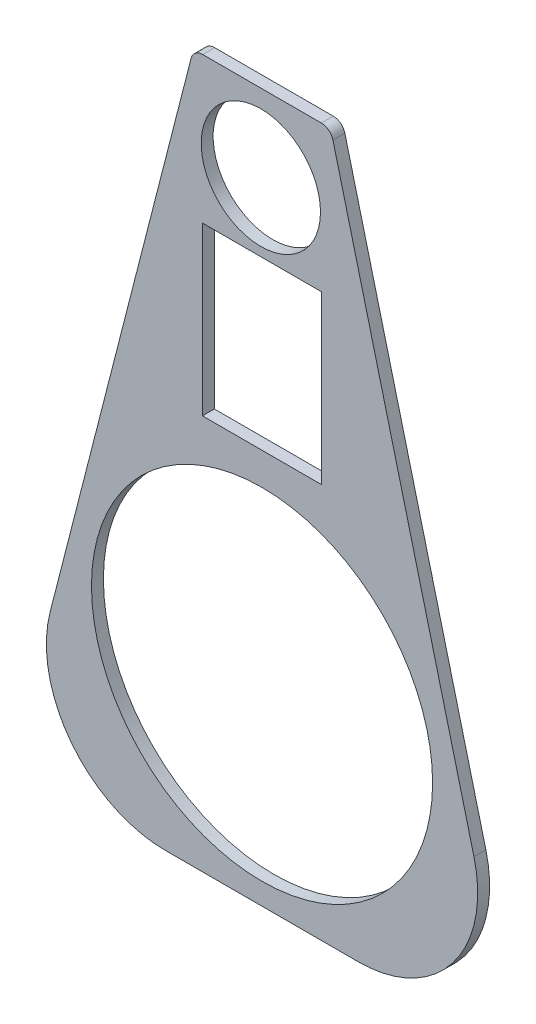
ISO-10303-21;
HEADER;
FILE_DESCRIPTION(('STEP AP214'),'2;1');
FILE_NAME('part.step','',(''),(''),'','','');
FILE_SCHEMA(('AUTOMOTIVE_DESIGN { 1 0 10303 214 1 1 1 1 }'));
ENDSEC;
DATA;
#1=APPLICATION_CONTEXT('core data for automotive mechanical design processes');
#2=APPLICATION_PROTOCOL_DEFINITION('international standard','automotive_design',2000,#1);
#3=PRODUCT_CONTEXT('',#1,'mechanical');
#4=PRODUCT('Part','Part','',(#3));
#5=PRODUCT_RELATED_PRODUCT_CATEGORY('part','',(#4));
#6=PRODUCT_DEFINITION_FORMATION('','',#4);
#7=PRODUCT_DEFINITION_CONTEXT('part definition',#1,'design');
#8=PRODUCT_DEFINITION('design','',#6,#7);
#9=PRODUCT_DEFINITION_SHAPE('','',#8);
#10=(LENGTH_UNIT() NAMED_UNIT(*) SI_UNIT(.MILLI.,.METRE.));
#11=(NAMED_UNIT(*) PLANE_ANGLE_UNIT() SI_UNIT($,.RADIAN.));
#12=(NAMED_UNIT(*) SI_UNIT($,.STERADIAN.) SOLID_ANGLE_UNIT());
#13=UNCERTAINTY_MEASURE_WITH_UNIT(LENGTH_MEASURE(1.E-05),#10,'distance_accuracy_value','');
#14=(GEOMETRIC_REPRESENTATION_CONTEXT(3) GLOBAL_UNCERTAINTY_ASSIGNED_CONTEXT((#13)) GLOBAL_UNIT_ASSIGNED_CONTEXT((#10,
#11,#12)) REPRESENTATION_CONTEXT('',''));
#15=CARTESIAN_POINT('',(0.,0.,0.));
#16=DIRECTION('',(0.,0.,1.));
#17=DIRECTION('',(1.,0.,0.));
#18=AXIS2_PLACEMENT_3D('',#15,#16,#17);
#19=CARTESIAN_POINT('',(0.,-1694.2708199846,50.));
#20=DIRECTION('',(0.,1.,0.));
#21=DIRECTION('',(0.,0.,1.));
#22=AXIS2_PLACEMENT_3D('',#19,#20,#21);
#23=PLANE('',#22);
#24=DIRECTION('',(1.,0.,0.));
#25=VECTOR('',#24,1.);
#26=CARTESIAN_POINT('',(0.,-1694.2708199846,0.));
#27=LINE('',#26,#25);
#28=CARTESIAN_POINT('',(-338.73114461899,-1694.2708199846,0.));
#29=VERTEX_POINT('',#28);
#30=CARTESIAN_POINT('',(469.362241970648,-1694.2708199846,0.));
#31=VERTEX_POINT('',#30);
#32=EDGE_CURVE('E201',#29,#31,#27,.T.);
#33=ORIENTED_EDGE('',*,*,#32,.T.);
#34=DIRECTION('',(0.,0.,-1.));
#35=VECTOR('',#34,1.);
#36=CARTESIAN_POINT('',(469.362241970648,-1694.2708199846,50.));
#37=LINE('',#36,#35);
#38=CARTESIAN_POINT('',(469.362241970648,-1694.2708199846,50.));
#39=VERTEX_POINT('',#38);
#40=EDGE_CURVE('E11',#39,#31,#37,.T.);
#41=ORIENTED_EDGE('',*,*,#40,.F.);
#42=DIRECTION('',(1.,0.,0.));
#43=VECTOR('',#42,1.);
#44=CARTESIAN_POINT('',(0.,-1694.2708199846,50.));
#45=LINE('',#44,#43);
#46=CARTESIAN_POINT('',(-338.73114461899,-1694.2708199846,50.));
#47=VERTEX_POINT('',#46);
#48=EDGE_CURVE('E287',#47,#39,#45,.T.);
#49=ORIENTED_EDGE('',*,*,#48,.F.);
#50=DIRECTION('',(0.,0.,-1.));
#51=VECTOR('',#50,1.);
#52=CARTESIAN_POINT('',(-338.73114461899,-1694.2708199846,50.));
#53=LINE('',#52,#51);
#54=EDGE_CURVE('E226',#47,#29,#53,.T.);
#55=ORIENTED_EDGE('',*,*,#54,.T.);
#56=EDGE_LOOP('',(#33,#41,#49,#55));
#57=FACE_BOUND('',#56,.T.);
#58=ADVANCED_FACE('F47',(#57),#23,.F.);
#59=CARTESIAN_POINT('',(469.362241970653,-1194.2708199846,50.));
#60=DIRECTION('',(0.,0.,-1.));
#61=DIRECTION('',(-1.,0.,0.));
#62=AXIS2_PLACEMENT_3D('',#59,#60,#61);
#63=CYLINDRICAL_SURFACE('',#62,500.);
#64=CARTESIAN_POINT('',(469.362241970653,-1194.2708199846,0.));
#65=DIRECTION('',(0.,0.,1.));
#66=DIRECTION('',(1.,0.,0.));
#67=AXIS2_PLACEMENT_3D('',#64,#65,#66);
#68=CIRCLE('',#67,500.);
#69=CARTESIAN_POINT('',(953.699706135871,-1070.10471830622,0.));
#70=VERTEX_POINT('',#69);
#71=EDGE_CURVE('E205',#31,#70,#68,.T.);
#72=ORIENTED_EDGE('',*,*,#71,.T.);
#73=DIRECTION('',(0.,0.,-1.));
#74=VECTOR('',#73,1.);
#75=CARTESIAN_POINT('',(953.699706135871,-1070.10471830622,50.));
#76=LINE('',#75,#74);
#77=CARTESIAN_POINT('',(953.699706135871,-1070.10471830622,50.));
#78=VERTEX_POINT('',#77);
#79=EDGE_CURVE('E58',#78,#70,#76,.T.);
#80=ORIENTED_EDGE('',*,*,#79,.F.);
#81=CARTESIAN_POINT('',(469.362241970653,-1194.2708199846,50.));
#82=DIRECTION('',(0.,0.,1.));
#83=DIRECTION('',(1.,0.,0.));
#84=AXIS2_PLACEMENT_3D('',#81,#82,#83);
#85=CIRCLE('',#84,500.);
#86=EDGE_CURVE('E290',#39,#78,#85,.T.);
#87=ORIENTED_EDGE('',*,*,#86,.F.);
#88=ORIENTED_EDGE('',*,*,#40,.T.);
#89=EDGE_LOOP('',(#72,#80,#87,#88));
#90=FACE_BOUND('',#89,.T.);
#91=ADVANCED_FACE('F325',(#90),#63,.T.);
#92=CARTESIAN_POINT('',(637.46901816695,163.423333487025,50.));
#93=DIRECTION('',(-0.968674928330439,-0.248332203356754,0.));
#94=DIRECTION('',(0.248332203356754,-0.968674928330439,0.));
#95=AXIS2_PLACEMENT_3D('',#92,#93,#94);
#96=PLANE('',#95);
#97=DIRECTION('',(-0.248332203356754,0.968674928330438,0.));
#98=VECTOR('',#97,1.);
#99=CARTESIAN_POINT('',(637.46901816695,163.423333487025,0.));
#100=LINE('',#99,#98);
#101=CARTESIAN_POINT('',(362.516639902291,1235.93616794683,0.));
#102=VERTEX_POINT('',#101);
#103=EDGE_CURVE('E208',#70,#102,#100,.T.);
#104=ORIENTED_EDGE('',*,*,#103,.T.);
#105=DIRECTION('',(0.,0.,-1.));
#106=VECTOR('',#105,1.);
#107=CARTESIAN_POINT('',(362.516639902291,1235.93616794683,50.));
#108=LINE('',#107,#106);
#109=CARTESIAN_POINT('',(362.516639902291,1235.93616794683,50.));
#110=VERTEX_POINT('',#109);
#111=EDGE_CURVE('E236',#110,#102,#108,.T.);
#112=ORIENTED_EDGE('',*,*,#111,.F.);
#113=DIRECTION('',(-0.248332203356754,0.968674928330438,0.));
#114=VECTOR('',#113,1.);
#115=CARTESIAN_POINT('',(637.46901816695,163.423333487025,50.));
#116=LINE('',#115,#114);
#117=EDGE_CURVE('E293',#78,#110,#116,.T.);
#118=ORIENTED_EDGE('',*,*,#117,.F.);
#119=ORIENTED_EDGE('',*,*,#79,.T.);
#120=EDGE_LOOP('',(#104,#112,#118,#119));
#121=FACE_BOUND('',#120,.T.);
#122=ADVANCED_FACE('F330',(#121),#96,.F.);
#123=CARTESIAN_POINT('',(314.08289348577,1223.519557779,50.));
#124=DIRECTION('',(0.,0.,-1.));
#125=DIRECTION('',(-1.,0.,0.));
#126=AXIS2_PLACEMENT_3D('',#123,#124,#125);
#127=CYLINDRICAL_SURFACE('',#126,49.9999999999997);
#128=CARTESIAN_POINT('',(314.08289348577,1223.519557779,0.));
#129=DIRECTION('',(0.,0.,1.));
#130=DIRECTION('',(1.,0.,0.));
#131=AXIS2_PLACEMENT_3D('',#128,#129,#130);
#132=CIRCLE('',#131,49.9999999999997);
#133=CARTESIAN_POINT('',(314.08289348577,1273.519557779,0.));
#134=VERTEX_POINT('',#133);
#135=EDGE_CURVE('E211',#102,#134,#132,.T.);
#136=ORIENTED_EDGE('',*,*,#135,.T.);
#137=DIRECTION('',(0.,0.,-1.));
#138=VECTOR('',#137,1.);
#139=CARTESIAN_POINT('',(314.08289348577,1273.519557779,50.));
#140=LINE('',#139,#138);
#141=CARTESIAN_POINT('',(314.08289348577,1273.519557779,50.));
#142=VERTEX_POINT('',#141);
#143=EDGE_CURVE('E233',#142,#134,#140,.T.);
#144=ORIENTED_EDGE('',*,*,#143,.F.);
#145=CARTESIAN_POINT('',(314.08289348577,1223.519557779,50.));
#146=DIRECTION('',(0.,0.,1.));
#147=DIRECTION('',(1.,0.,0.));
#148=AXIS2_PLACEMENT_3D('',#145,#146,#147);
#149=CIRCLE('',#148,49.9999999999997);
#150=EDGE_CURVE('E171',#110,#142,#149,.T.);
#151=ORIENTED_EDGE('',*,*,#150,.F.);
#152=ORIENTED_EDGE('',*,*,#111,.T.);
#153=EDGE_LOOP('',(#136,#144,#151,#152));
#154=FACE_BOUND('',#153,.T.);
#155=ADVANCED_FACE('F301',(#154),#127,.T.);
#156=CARTESIAN_POINT('',(0.,1273.519557779,50.));
#157=DIRECTION('',(0.,1.,0.));
#158=DIRECTION('',(0.,0.,1.));
#159=AXIS2_PLACEMENT_3D('',#156,#157,#158);
#160=PLANE('',#159);
#161=DIRECTION('',(1.,0.,0.));
#162=VECTOR('',#161,1.);
#163=CARTESIAN_POINT('',(0.,1273.519557779,0.));
#164=LINE('',#163,#162);
#165=CARTESIAN_POINT('',(-183.451796134111,1273.519557779,0.));
#166=VERTEX_POINT('',#165);
#167=EDGE_CURVE('E215',#166,#134,#164,.T.);
#168=ORIENTED_EDGE('',*,*,#167,.F.);
#169=DIRECTION('',(0.,0.,-1.));
#170=VECTOR('',#169,1.);
#171=CARTESIAN_POINT('',(-183.451796134111,1273.519557779,50.));
#172=LINE('',#171,#170);
#173=CARTESIAN_POINT('',(-183.451796134111,1273.519557779,50.));
#174=VERTEX_POINT('',#173);
#175=EDGE_CURVE('E157',#174,#166,#172,.T.);
#176=ORIENTED_EDGE('',*,*,#175,.F.);
#177=DIRECTION('',(1.,0.,0.));
#178=VECTOR('',#177,1.);
#179=CARTESIAN_POINT('',(0.,1273.519557779,50.));
#180=LINE('',#179,#178);
#181=EDGE_CURVE('E167',#174,#142,#180,.T.);
#182=ORIENTED_EDGE('',*,*,#181,.T.);
#183=ORIENTED_EDGE('',*,*,#143,.T.);
#184=EDGE_LOOP('',(#168,#176,#182,#183));
#185=FACE_BOUND('',#184,.T.);
#186=ADVANCED_FACE('F305',(#185),#160,.T.);
#187=CARTESIAN_POINT('',(-183.451796134111,1223.519557779,50.));
#188=DIRECTION('',(0.,0.,-1.));
#189=DIRECTION('',(-1.,0.,0.));
#190=AXIS2_PLACEMENT_3D('',#187,#188,#189);
#191=CYLINDRICAL_SURFACE('',#190,49.9999999999999);
#192=CARTESIAN_POINT('',(-183.451796134111,1223.519557779,0.));
#193=DIRECTION('',(0.,0.,1.));
#194=DIRECTION('',(1.,0.,0.));
#195=AXIS2_PLACEMENT_3D('',#192,#193,#194);
#196=CIRCLE('',#195,49.9999999999999);
#197=CARTESIAN_POINT('',(-231.885542550633,1235.93616794683,0.));
#198=VERTEX_POINT('',#197);
#199=EDGE_CURVE('E155',#198,#166,#196,.F.);
#200=ORIENTED_EDGE('',*,*,#199,.F.);
#201=DIRECTION('',(0.,0.,-1.));
#202=VECTOR('',#201,1.);
#203=CARTESIAN_POINT('',(-231.885542550633,1235.93616794683,50.));
#204=LINE('',#203,#202);
#205=CARTESIAN_POINT('',(-231.885542550633,1235.93616794683,50.));
#206=VERTEX_POINT('',#205);
#207=EDGE_CURVE('E149',#206,#198,#204,.T.);
#208=ORIENTED_EDGE('',*,*,#207,.F.);
#209=CARTESIAN_POINT('',(-183.451796134111,1223.519557779,50.));
#210=DIRECTION('',(0.,0.,1.));
#211=DIRECTION('',(1.,0.,0.));
#212=AXIS2_PLACEMENT_3D('',#209,#210,#211);
#213=CIRCLE('',#212,49.9999999999999);
#214=EDGE_CURVE('E153',#206,#174,#213,.F.);
#215=ORIENTED_EDGE('',*,*,#214,.T.);
#216=ORIENTED_EDGE('',*,*,#175,.T.);
#217=EDGE_LOOP('',(#200,#208,#215,#216));
#218=FACE_BOUND('',#217,.T.);
#219=ADVANCED_FACE('F151',(#218),#191,.T.);
#220=CARTESIAN_POINT('',(-514.893794703296,131.999607705106,50.));
#221=DIRECTION('',(0.968674928330438,-0.248332203356753,0.));
#222=DIRECTION('',(0.248332203356753,0.968674928330439,0.));
#223=AXIS2_PLACEMENT_3D('',#220,#221,#222);
#224=PLANE('',#223);
#225=DIRECTION('',(-0.248332203356753,-0.968674928330439,0.));
#226=VECTOR('',#225,1.);
#227=CARTESIAN_POINT('',(-514.893794703296,131.999607705106,0.));
#228=LINE('',#227,#226);
#229=CARTESIAN_POINT('',(-823.068608784213,-1070.10471830622,0.));
#230=VERTEX_POINT('',#229);
#231=EDGE_CURVE('E107',#198,#230,#228,.T.);
#232=ORIENTED_EDGE('',*,*,#231,.T.);
#233=DIRECTION('',(0.,0.,-1.));
#234=VECTOR('',#233,1.);
#235=CARTESIAN_POINT('',(-823.068608784213,-1070.10471830622,50.));
#236=LINE('',#235,#234);
#237=CARTESIAN_POINT('',(-823.068608784213,-1070.10471830622,50.));
#238=VERTEX_POINT('',#237);
#239=EDGE_CURVE('E158',#238,#230,#236,.T.);
#240=ORIENTED_EDGE('',*,*,#239,.F.);
#241=DIRECTION('',(-0.248332203356753,-0.968674928330439,0.));
#242=VECTOR('',#241,1.);
#243=CARTESIAN_POINT('',(-514.893794703296,131.999607705106,50.));
#244=LINE('',#243,#242);
#245=EDGE_CURVE('E160',#206,#238,#244,.T.);
#246=ORIENTED_EDGE('',*,*,#245,.F.);
#247=ORIENTED_EDGE('',*,*,#207,.T.);
#248=EDGE_LOOP('',(#232,#240,#246,#247));
#249=FACE_BOUND('',#248,.T.);
#250=ADVANCED_FACE('F161',(#249),#224,.F.);
#251=CARTESIAN_POINT('',(315.315548675829,0.,50.));
#252=DIRECTION('',(-1.,0.,0.));
#253=DIRECTION('',(0.,0.,1.));
#254=AXIS2_PLACEMENT_3D('',#251,#252,#253);
#255=PLANE('',#254);
#256=DIRECTION('',(0.,1.,0.));
#257=VECTOR('',#256,1.);
#258=CARTESIAN_POINT('',(315.315548675829,0.,0.));
#259=LINE('',#258,#257);
#260=CARTESIAN_POINT('',(315.315548675829,-38.891859178654,0.));
#261=VERTEX_POINT('',#260);
#262=CARTESIAN_POINT('',(315.315548675829,661.108140821346,0.));
#263=VERTEX_POINT('',#262);
#264=EDGE_CURVE('E178',#261,#263,#259,.T.);
#265=ORIENTED_EDGE('',*,*,#264,.F.);
#266=DIRECTION('',(0.,0.,-1.));
#267=VECTOR('',#266,1.);
#268=CARTESIAN_POINT('',(315.315548675829,-38.891859178654,50.));
#269=LINE('',#268,#267);
#270=CARTESIAN_POINT('',(315.315548675829,-38.891859178654,50.));
#271=VERTEX_POINT('',#270);
#272=EDGE_CURVE('E51',#271,#261,#269,.T.);
#273=ORIENTED_EDGE('',*,*,#272,.F.);
#274=DIRECTION('',(0.,1.,0.));
#275=VECTOR('',#274,1.);
#276=CARTESIAN_POINT('',(315.315548675829,0.,50.));
#277=LINE('',#276,#275);
#278=CARTESIAN_POINT('',(315.315548675829,661.108140821346,50.));
#279=VERTEX_POINT('',#278);
#280=EDGE_CURVE('E225',#271,#279,#277,.T.);
#281=ORIENTED_EDGE('',*,*,#280,.T.);
#282=DIRECTION('',(0.,0.,-1.));
#283=VECTOR('',#282,1.);
#284=CARTESIAN_POINT('',(315.315548675829,661.108140821346,50.));
#285=LINE('',#284,#283);
#286=EDGE_CURVE('E177',#279,#263,#285,.T.);
#287=ORIENTED_EDGE('',*,*,#286,.T.);
#288=EDGE_LOOP('',(#265,#273,#281,#287));
#289=FACE_BOUND('',#288,.T.);
#290=ADVANCED_FACE('F49',(#289),#255,.T.);
#291=CARTESIAN_POINT('',(0.,-38.891859178654,50.));
#292=DIRECTION('',(0.,1.,0.));
#293=DIRECTION('',(0.,0.,1.));
#294=AXIS2_PLACEMENT_3D('',#291,#292,#293);
#295=PLANE('',#294);
#296=DIRECTION('',(1.,0.,0.));
#297=VECTOR('',#296,1.);
#298=CARTESIAN_POINT('',(0.,-38.891859178654,0.));
#299=LINE('',#298,#297);
#300=CARTESIAN_POINT('',(-184.684451324171,-38.891859178654,0.));
#301=VERTEX_POINT('',#300);
#302=EDGE_CURVE('E182',#301,#261,#299,.T.);
#303=ORIENTED_EDGE('',*,*,#302,.F.);
#304=DIRECTION('',(0.,0.,-1.));
#305=VECTOR('',#304,1.);
#306=CARTESIAN_POINT('',(-184.684451324171,-38.891859178654,50.));
#307=LINE('',#306,#305);
#308=CARTESIAN_POINT('',(-184.684451324171,-38.891859178654,50.));
#309=VERTEX_POINT('',#308);
#310=EDGE_CURVE('E248',#309,#301,#307,.T.);
#311=ORIENTED_EDGE('',*,*,#310,.F.);
#312=DIRECTION('',(1.,0.,0.));
#313=VECTOR('',#312,1.);
#314=CARTESIAN_POINT('',(0.,-38.891859178654,50.));
#315=LINE('',#314,#313);
#316=EDGE_CURVE('E259',#309,#271,#315,.T.);
#317=ORIENTED_EDGE('',*,*,#316,.T.);
#318=ORIENTED_EDGE('',*,*,#272,.T.);
#319=EDGE_LOOP('',(#303,#311,#317,#318));
#320=FACE_BOUND('',#319,.T.);
#321=ADVANCED_FACE('F257',(#320),#295,.T.);
#322=CARTESIAN_POINT('',(-184.684451324171,0.,50.));
#323=DIRECTION('',(-1.,0.,0.));
#324=DIRECTION('',(0.,0.,1.));
#325=AXIS2_PLACEMENT_3D('',#322,#323,#324);
#326=PLANE('',#325);
#327=DIRECTION('',(0.,1.,0.));
#328=VECTOR('',#327,1.);
#329=CARTESIAN_POINT('',(-184.684451324171,0.,0.));
#330=LINE('',#329,#328);
#331=CARTESIAN_POINT('',(-184.684451324171,661.108140821346,0.));
#332=VERTEX_POINT('',#331);
#333=EDGE_CURVE('E186',#301,#332,#330,.T.);
#334=ORIENTED_EDGE('',*,*,#333,.T.);
#335=DIRECTION('',(0.,0.,-1.));
#336=VECTOR('',#335,1.);
#337=CARTESIAN_POINT('',(-184.684451324171,661.108140821346,50.));
#338=LINE('',#337,#336);
#339=CARTESIAN_POINT('',(-184.684451324171,661.108140821346,50.));
#340=VERTEX_POINT('',#339);
#341=EDGE_CURVE('E245',#340,#332,#338,.T.);
#342=ORIENTED_EDGE('',*,*,#341,.F.);
#343=DIRECTION('',(0.,1.,0.));
#344=VECTOR('',#343,1.);
#345=CARTESIAN_POINT('',(-184.684451324171,0.,50.));
#346=LINE('',#345,#344);
#347=EDGE_CURVE('E274',#309,#340,#346,.T.);
#348=ORIENTED_EDGE('',*,*,#347,.F.);
#349=ORIENTED_EDGE('',*,*,#310,.T.);
#350=EDGE_LOOP('',(#334,#342,#348,#349));
#351=FACE_BOUND('',#350,.T.);
#352=ADVANCED_FACE('F266',(#351),#326,.F.);
#353=CARTESIAN_POINT('',(65.3155486758294,-888.891859178654,50.));
#354=DIRECTION('',(0.,0.,-1.));
#355=DIRECTION('',(-1.,0.,0.));
#356=AXIS2_PLACEMENT_3D('',#353,#354,#355);
#357=CYLINDRICAL_SURFACE('',#356,715.);
#358=CARTESIAN_POINT('',(65.3155486758294,-888.891859178654,50.));
#359=DIRECTION('',(0.,0.,1.));
#360=DIRECTION('',(1.,0.,0.));
#361=AXIS2_PLACEMENT_3D('',#358,#359,#360);
#362=CIRCLE('',#361,715.);
#363=CARTESIAN_POINT('',(780.315548675829,-888.891859178654,50.));
#364=VERTEX_POINT('',#363);
#365=EDGE_CURVE('E279',#364,#364,#362,.T.);
#366=ORIENTED_EDGE('',*,*,#365,.T.);
#367=EDGE_LOOP('',(#366));
#368=FACE_BOUND('',#367,.T.);
#369=CARTESIAN_POINT('',(65.3155486758294,-888.891859178654,0.));
#370=DIRECTION('',(0.,0.,1.));
#371=DIRECTION('',(1.,0.,0.));
#372=AXIS2_PLACEMENT_3D('',#369,#370,#371);
#373=CIRCLE('',#372,715.);
#374=CARTESIAN_POINT('',(780.315548675829,-888.891859178654,0.));
#375=VERTEX_POINT('',#374);
#376=EDGE_CURVE('E197',#375,#375,#373,.T.);
#377=ORIENTED_EDGE('',*,*,#376,.F.);
#378=EDGE_LOOP('',(#377));
#379=FACE_BOUND('',#378,.T.);
#380=ADVANCED_FACE('F335',(#368,#379),#357,.F.);
#381=CARTESIAN_POINT('',(60.2946654603559,948.352728730567,50.));
#382=DIRECTION('',(0.,0.,-1.));
#383=DIRECTION('',(-1.,0.,0.));
#384=AXIS2_PLACEMENT_3D('',#381,#382,#383);
#385=CYLINDRICAL_SURFACE('',#384,250.);
#386=CARTESIAN_POINT('',(60.2946654603559,948.352728730567,50.));
#387=DIRECTION('',(0.,0.,1.));
#388=DIRECTION('',(1.,0.,0.));
#389=AXIS2_PLACEMENT_3D('',#386,#387,#388);
#390=CIRCLE('',#389,250.);
#391=CARTESIAN_POINT('',(310.294665460356,948.352728730567,50.));
#392=VERTEX_POINT('',#391);
#393=EDGE_CURVE('E273',#392,#392,#390,.T.);
#394=ORIENTED_EDGE('',*,*,#393,.T.);
#395=EDGE_LOOP('',(#394));
#396=FACE_BOUND('',#395,.T.);
#397=CARTESIAN_POINT('',(60.2946654603559,948.352728730567,0.));
#398=DIRECTION('',(0.,0.,1.));
#399=DIRECTION('',(1.,0.,0.));
#400=AXIS2_PLACEMENT_3D('',#397,#398,#399);
#401=CIRCLE('',#400,250.);
#402=CARTESIAN_POINT('',(310.294665460356,948.352728730567,0.));
#403=VERTEX_POINT('',#402);
#404=EDGE_CURVE('E193',#403,#403,#401,.T.);
#405=ORIENTED_EDGE('',*,*,#404,.F.);
#406=EDGE_LOOP('',(#405));
#407=FACE_BOUND('',#406,.T.);
#408=ADVANCED_FACE('F320',(#396,#407),#385,.F.);
#409=CARTESIAN_POINT('',(0.,661.108140821346,50.));
#410=DIRECTION('',(0.,1.,0.));
#411=DIRECTION('',(0.,0.,1.));
#412=AXIS2_PLACEMENT_3D('',#409,#410,#411);
#413=PLANE('',#412);
#414=DIRECTION('',(1.,0.,0.));
#415=VECTOR('',#414,1.);
#416=CARTESIAN_POINT('',(0.,661.108140821346,0.));
#417=LINE('',#416,#415);
#418=EDGE_CURVE('E189',#332,#263,#417,.T.);
#419=ORIENTED_EDGE('',*,*,#418,.T.);
#420=ORIENTED_EDGE('',*,*,#286,.F.);
#421=DIRECTION('',(1.,0.,0.));
#422=VECTOR('',#421,1.);
#423=CARTESIAN_POINT('',(0.,661.108140821346,50.));
#424=LINE('',#423,#422);
#425=EDGE_CURVE('E270',#340,#279,#424,.T.);
#426=ORIENTED_EDGE('',*,*,#425,.F.);
#427=ORIENTED_EDGE('',*,*,#341,.T.);
#428=EDGE_LOOP('',(#419,#420,#426,#427));
#429=FACE_BOUND('',#428,.T.);
#430=ADVANCED_FACE('F269',(#429),#413,.F.);
#431=CARTESIAN_POINT('',(-338.731144618995,-1194.2708199846,50.));
#432=DIRECTION('',(0.,0.,-1.));
#433=DIRECTION('',(-1.,0.,0.));
#434=AXIS2_PLACEMENT_3D('',#431,#432,#433);
#435=CYLINDRICAL_SURFACE('',#434,500.);
#436=CARTESIAN_POINT('',(-338.731144618995,-1194.2708199846,0.));
#437=DIRECTION('',(0.,0.,1.));
#438=DIRECTION('',(1.,0.,0.));
#439=AXIS2_PLACEMENT_3D('',#436,#437,#438);
#440=CIRCLE('',#439,500.);
#441=EDGE_CURVE('E113',#230,#29,#440,.T.);
#442=ORIENTED_EDGE('',*,*,#441,.T.);
#443=ORIENTED_EDGE('',*,*,#54,.F.);
#444=CARTESIAN_POINT('',(-338.731144618995,-1194.2708199846,50.));
#445=DIRECTION('',(0.,0.,1.));
#446=DIRECTION('',(1.,0.,0.));
#447=AXIS2_PLACEMENT_3D('',#444,#445,#446);
#448=CIRCLE('',#447,500.);
#449=EDGE_CURVE('E67',#238,#47,#448,.T.);
#450=ORIENTED_EDGE('',*,*,#449,.F.);
#451=ORIENTED_EDGE('',*,*,#239,.T.);
#452=EDGE_LOOP('',(#442,#443,#450,#451));
#453=FACE_BOUND('',#452,.T.);
#454=ADVANCED_FACE('F312',(#453),#435,.T.);
#455=CARTESIAN_POINT('',(0.,0.,50.));
#456=DIRECTION('',(0.,0.,1.));
#457=DIRECTION('',(1.,0.,0.));
#458=AXIS2_PLACEMENT_3D('',#455,#456,#457);
#459=PLANE('',#458);
#460=ORIENTED_EDGE('',*,*,#280,.F.);
#461=ORIENTED_EDGE('',*,*,#316,.F.);
#462=ORIENTED_EDGE('',*,*,#347,.T.);
#463=ORIENTED_EDGE('',*,*,#425,.T.);
#464=EDGE_LOOP('',(#460,#461,#462,#463));
#465=FACE_BOUND('',#464,.T.);
#466=ORIENTED_EDGE('',*,*,#393,.F.);
#467=EDGE_LOOP('',(#466));
#468=FACE_BOUND('',#467,.T.);
#469=ORIENTED_EDGE('',*,*,#365,.F.);
#470=EDGE_LOOP('',(#469));
#471=FACE_BOUND('',#470,.T.);
#472=ORIENTED_EDGE('',*,*,#48,.T.);
#473=ORIENTED_EDGE('',*,*,#86,.T.);
#474=ORIENTED_EDGE('',*,*,#117,.T.);
#475=ORIENTED_EDGE('',*,*,#150,.T.);
#476=ORIENTED_EDGE('',*,*,#181,.F.);
#477=ORIENTED_EDGE('',*,*,#214,.F.);
#478=ORIENTED_EDGE('',*,*,#245,.T.);
#479=ORIENTED_EDGE('',*,*,#449,.T.);
#480=EDGE_LOOP('',(#472,#473,#474,#475,#476,#477,#478,#479));
#481=FACE_BOUND('',#480,.T.);
#482=ADVANCED_FACE('F165',(#465,#468,#471,#481),#459,.T.);
#483=CARTESIAN_POINT('',(0.,0.,0.));
#484=DIRECTION('',(0.,0.,1.));
#485=DIRECTION('',(1.,0.,0.));
#486=AXIS2_PLACEMENT_3D('',#483,#484,#485);
#487=PLANE('',#486);
#488=ORIENTED_EDGE('',*,*,#264,.T.);
#489=ORIENTED_EDGE('',*,*,#418,.F.);
#490=ORIENTED_EDGE('',*,*,#333,.F.);
#491=ORIENTED_EDGE('',*,*,#302,.T.);
#492=EDGE_LOOP('',(#488,#489,#490,#491));
#493=FACE_BOUND('',#492,.T.);
#494=ORIENTED_EDGE('',*,*,#404,.T.);
#495=EDGE_LOOP('',(#494));
#496=FACE_BOUND('',#495,.T.);
#497=ORIENTED_EDGE('',*,*,#376,.T.);
#498=EDGE_LOOP('',(#497));
#499=FACE_BOUND('',#498,.T.);
#500=ORIENTED_EDGE('',*,*,#32,.F.);
#501=ORIENTED_EDGE('',*,*,#441,.F.);
#502=ORIENTED_EDGE('',*,*,#231,.F.);
#503=ORIENTED_EDGE('',*,*,#199,.T.);
#504=ORIENTED_EDGE('',*,*,#167,.T.);
#505=ORIENTED_EDGE('',*,*,#135,.F.);
#506=ORIENTED_EDGE('',*,*,#103,.F.);
#507=ORIENTED_EDGE('',*,*,#71,.F.);
#508=EDGE_LOOP('',(#500,#501,#502,#503,#504,#505,#506,#507));
#509=FACE_BOUND('',#508,.T.);
#510=ADVANCED_FACE('F263',(#493,#496,#499,#509),#487,.F.);
#511=CLOSED_SHELL('',(#58,#91,#122,#155,#186,#219,#250,#290,#321,#352,#380,#408,#430,#454,#482,#510));
#512=MANIFOLD_SOLID_BREP('B2',#511);
#513=ADVANCED_BREP_SHAPE_REPRESENTATION('',(#18,#512),#14);
#514=SHAPE_DEFINITION_REPRESENTATION(#9,#513);
ENDSEC;
END-ISO-10303-21;
